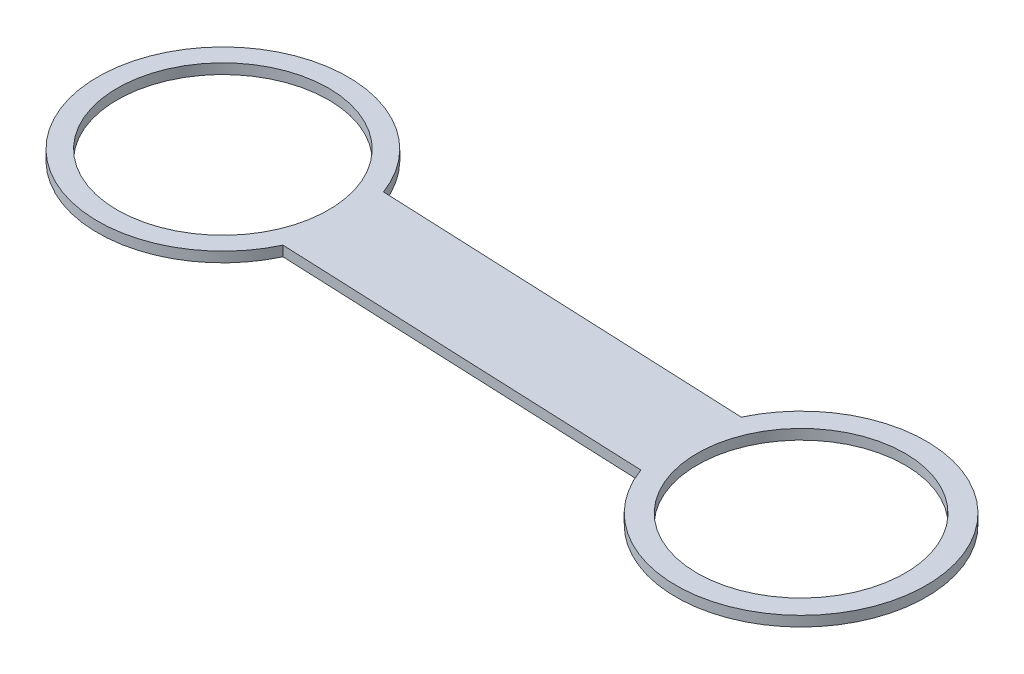
ISO-10303-21;
HEADER;
FILE_DESCRIPTION(('STEP AP214'),'2;1');
FILE_NAME('part.step','',(''),(''),'','','');
FILE_SCHEMA(('AUTOMOTIVE_DESIGN { 1 0 10303 214 1 1 1 1 }'));
ENDSEC;
DATA;
#1=APPLICATION_CONTEXT('core data for automotive mechanical design processes');
#2=APPLICATION_PROTOCOL_DEFINITION('international standard','automotive_design',2000,#1);
#3=PRODUCT_CONTEXT('',#1,'mechanical');
#4=PRODUCT('Part','Part','',(#3));
#5=PRODUCT_RELATED_PRODUCT_CATEGORY('part','',(#4));
#6=PRODUCT_DEFINITION_FORMATION('','',#4);
#7=PRODUCT_DEFINITION_CONTEXT('part definition',#1,'design');
#8=PRODUCT_DEFINITION('design','',#6,#7);
#9=PRODUCT_DEFINITION_SHAPE('','',#8);
#10=(LENGTH_UNIT() NAMED_UNIT(*) SI_UNIT(.MILLI.,.METRE.));
#11=(NAMED_UNIT(*) PLANE_ANGLE_UNIT() SI_UNIT($,.RADIAN.));
#12=(NAMED_UNIT(*) SI_UNIT($,.STERADIAN.) SOLID_ANGLE_UNIT());
#13=UNCERTAINTY_MEASURE_WITH_UNIT(LENGTH_MEASURE(1.E-05),#10,'distance_accuracy_value','');
#14=(GEOMETRIC_REPRESENTATION_CONTEXT(3) GLOBAL_UNCERTAINTY_ASSIGNED_CONTEXT((#13)) GLOBAL_UNIT_ASSIGNED_CONTEXT((#10,
#11,#12)) REPRESENTATION_CONTEXT('',''));
#15=CARTESIAN_POINT('',(0.,0.,0.));
#16=DIRECTION('',(0.,0.,1.));
#17=DIRECTION('',(1.,0.,0.));
#18=AXIS2_PLACEMENT_3D('',#15,#16,#17);
#19=CARTESIAN_POINT('',(178.811009985878,3.,7.77208167310776));
#20=DIRECTION('',(0.,1.,0.));
#21=DIRECTION('',(0.,0.,1.));
#22=AXIS2_PLACEMENT_3D('',#19,#20,#21);
#23=PLANE('',#22);
#24=CARTESIAN_POINT('',(0.,3.,0.));
#25=DIRECTION('',(0.,1.,0.));
#26=DIRECTION('',(0.,0.,1.));
#27=AXIS2_PLACEMENT_3D('',#24,#25,#26);
#28=CIRCLE('',#27,31.242);
#29=CARTESIAN_POINT('',(0.,3.,31.242));
#30=VERTEX_POINT('',#29);
#31=EDGE_CURVE('E100',#30,#30,#28,.T.);
#32=ORIENTED_EDGE('',*,*,#31,.F.);
#33=EDGE_LOOP('',(#32));
#34=FACE_BOUND('',#33,.T.);
#35=CARTESIAN_POINT('',(178.811009985878,3.,7.77208167310776));
#36=DIRECTION('',(0.,1.,0.));
#37=DIRECTION('',(0.,0.,1.));
#38=AXIS2_PLACEMENT_3D('',#35,#36,#37);
#39=CIRCLE('',#38,37.);
#40=CARTESIAN_POINT('',(144.033066177761,3.,20.4011997927322));
#41=VERTEX_POINT('',#40);
#42=CARTESIAN_POINT('',(145.341023246645,3.,-8.00004524990167));
#43=VERTEX_POINT('',#42);
#44=EDGE_CURVE('E85',#41,#43,#39,.T.);
#45=ORIENTED_EDGE('',*,*,#44,.T.);
#46=DIRECTION('',(-0.999069440720653,0.,-0.0431306459274788));
#47=VECTOR('',#46,1.);
#48=CARTESIAN_POINT('',(34.7244553413585,3.,-12.7754530740009));
#49=LINE('',#48,#47);
#50=CARTESIAN_POINT('',(34.7244553413585,3.,-12.7754530740009));
#51=VERTEX_POINT('',#50);
#52=EDGE_CURVE('E80',#43,#51,#49,.T.);
#53=ORIENTED_EDGE('',*,*,#52,.T.);
#54=CARTESIAN_POINT('',(0.,3.,0.));
#55=DIRECTION('',(0.,1.,0.));
#56=DIRECTION('',(0.,0.,1.));
#57=AXIS2_PLACEMENT_3D('',#54,#55,#56);
#58=CIRCLE('',#57,37.);
#59=CARTESIAN_POINT('',(33.4954140569429,3.,15.7180544964684));
#60=VERTEX_POINT('',#59);
#61=EDGE_CURVE('E83',#51,#60,#58,.T.);
#62=ORIENTED_EDGE('',*,*,#61,.T.);
#63=DIRECTION('',(0.99910372636415,0.,0.042328996743008));
#64=VECTOR('',#63,1.);
#65=CARTESIAN_POINT('',(33.4954140569429,3.,15.7180544964684));
#66=LINE('',#65,#64);
#67=EDGE_CURVE('E50',#60,#41,#66,.T.);
#68=ORIENTED_EDGE('',*,*,#67,.T.);
#69=EDGE_LOOP('',(#45,#53,#62,#68));
#70=FACE_BOUND('',#69,.T.);
#71=CARTESIAN_POINT('',(178.811009985878,3.,7.77208167310776));
#72=DIRECTION('',(0.,1.,0.));
#73=DIRECTION('',(0.,0.,1.));
#74=AXIS2_PLACEMENT_3D('',#71,#72,#73);
#75=CIRCLE('',#74,30.734);
#76=CARTESIAN_POINT('',(178.811009985878,3.,38.5060816731077));
#77=VERTEX_POINT('',#76);
#78=EDGE_CURVE('E115',#77,#77,#75,.T.);
#79=ORIENTED_EDGE('',*,*,#78,.F.);
#80=EDGE_LOOP('',(#79));
#81=FACE_BOUND('',#80,.T.);
#82=ADVANCED_FACE('F33',(#34,#70,#81),#23,.T.);
#83=CARTESIAN_POINT('',(178.811009985878,0.,7.77208167310776));
#84=DIRECTION('',(0.,1.,0.));
#85=DIRECTION('',(0.,0.,1.));
#86=AXIS2_PLACEMENT_3D('',#83,#84,#85);
#87=PLANE('',#86);
#88=CARTESIAN_POINT('',(178.811009985878,0.,7.77208167310776));
#89=DIRECTION('',(0.,1.,0.));
#90=DIRECTION('',(0.,0.,1.));
#91=AXIS2_PLACEMENT_3D('',#88,#89,#90);
#92=CIRCLE('',#91,37.);
#93=CARTESIAN_POINT('',(144.033066177761,0.,20.4011997927322));
#94=VERTEX_POINT('',#93);
#95=CARTESIAN_POINT('',(145.341023246645,0.,-8.00004524990167));
#96=VERTEX_POINT('',#95);
#97=EDGE_CURVE('E97',#94,#96,#92,.T.);
#98=ORIENTED_EDGE('',*,*,#97,.F.);
#99=DIRECTION('',(0.99910372636415,0.,0.042328996743008));
#100=VECTOR('',#99,1.);
#101=CARTESIAN_POINT('',(33.4954140569429,0.,15.7180544964684));
#102=LINE('',#101,#100);
#103=CARTESIAN_POINT('',(33.4954140569429,0.,15.7180544964684));
#104=VERTEX_POINT('',#103);
#105=EDGE_CURVE('E73',#104,#94,#102,.T.);
#106=ORIENTED_EDGE('',*,*,#105,.F.);
#107=CARTESIAN_POINT('',(0.,0.,0.));
#108=DIRECTION('',(0.,1.,0.));
#109=DIRECTION('',(0.,0.,1.));
#110=AXIS2_PLACEMENT_3D('',#107,#108,#109);
#111=CIRCLE('',#110,37.);
#112=CARTESIAN_POINT('',(34.7244553413585,0.,-12.7754530740009));
#113=VERTEX_POINT('',#112);
#114=EDGE_CURVE('E67',#113,#104,#111,.T.);
#115=ORIENTED_EDGE('',*,*,#114,.F.);
#116=DIRECTION('',(-0.999069440720653,0.,-0.0431306459274788));
#117=VECTOR('',#116,1.);
#118=CARTESIAN_POINT('',(34.7244553413585,0.,-12.7754530740009));
#119=LINE('',#118,#117);
#120=EDGE_CURVE('E89',#96,#113,#119,.T.);
#121=ORIENTED_EDGE('',*,*,#120,.F.);
#122=EDGE_LOOP('',(#98,#106,#115,#121));
#123=FACE_BOUND('',#122,.T.);
#124=CARTESIAN_POINT('',(0.,0.,0.));
#125=DIRECTION('',(0.,1.,0.));
#126=DIRECTION('',(0.,0.,1.));
#127=AXIS2_PLACEMENT_3D('',#124,#125,#126);
#128=CIRCLE('',#127,31.242);
#129=CARTESIAN_POINT('',(0.,0.,31.242));
#130=VERTEX_POINT('',#129);
#131=EDGE_CURVE('E112',#130,#130,#128,.T.);
#132=ORIENTED_EDGE('',*,*,#131,.T.);
#133=EDGE_LOOP('',(#132));
#134=FACE_BOUND('',#133,.T.);
#135=CARTESIAN_POINT('',(178.811009985878,0.,7.77208167310776));
#136=DIRECTION('',(0.,1.,0.));
#137=DIRECTION('',(0.,0.,1.));
#138=AXIS2_PLACEMENT_3D('',#135,#136,#137);
#139=CIRCLE('',#138,30.734);
#140=CARTESIAN_POINT('',(178.811009985878,0.,38.5060816731077));
#141=VERTEX_POINT('',#140);
#142=EDGE_CURVE('E118',#141,#141,#139,.T.);
#143=ORIENTED_EDGE('',*,*,#142,.T.);
#144=EDGE_LOOP('',(#143));
#145=FACE_BOUND('',#144,.T.);
#146=ADVANCED_FACE('F108',(#123,#134,#145),#87,.F.);
#147=CARTESIAN_POINT('',(178.811009985878,3.,7.77208167310776));
#148=DIRECTION('',(0.,-1.,0.));
#149=DIRECTION('',(0.,0.,-1.));
#150=AXIS2_PLACEMENT_3D('',#147,#148,#149);
#151=CYLINDRICAL_SURFACE('',#150,37.);
#152=ORIENTED_EDGE('',*,*,#97,.T.);
#153=DIRECTION('',(0.,-1.,0.));
#154=VECTOR('',#153,1.);
#155=CARTESIAN_POINT('',(145.341023246645,3.,-8.00004524990167));
#156=LINE('',#155,#154);
#157=EDGE_CURVE('E11',#43,#96,#156,.T.);
#158=ORIENTED_EDGE('',*,*,#157,.F.);
#159=ORIENTED_EDGE('',*,*,#44,.F.);
#160=DIRECTION('',(0.,-1.,0.));
#161=VECTOR('',#160,1.);
#162=CARTESIAN_POINT('',(144.033066177761,3.,20.4011997927322));
#163=LINE('',#162,#161);
#164=EDGE_CURVE('E93',#41,#94,#163,.T.);
#165=ORIENTED_EDGE('',*,*,#164,.T.);
#166=EDGE_LOOP('',(#152,#158,#159,#165));
#167=FACE_BOUND('',#166,.T.);
#168=ADVANCED_FACE('F35',(#167),#151,.T.);
#169=CARTESIAN_POINT('',(34.7244553413585,3.,-12.7754530740009));
#170=DIRECTION('',(-0.0431306459274788,0.,0.999069440720653));
#171=DIRECTION('',(0.999069440720653,0.,0.0431306459274788));
#172=AXIS2_PLACEMENT_3D('',#169,#170,#171);
#173=PLANE('',#172);
#174=ORIENTED_EDGE('',*,*,#120,.T.);
#175=DIRECTION('',(0.,-1.,0.));
#176=VECTOR('',#175,1.);
#177=CARTESIAN_POINT('',(34.7244553413585,3.,-12.7754530740009));
#178=LINE('',#177,#176);
#179=EDGE_CURVE('E42',#51,#113,#178,.T.);
#180=ORIENTED_EDGE('',*,*,#179,.F.);
#181=ORIENTED_EDGE('',*,*,#52,.F.);
#182=ORIENTED_EDGE('',*,*,#157,.T.);
#183=EDGE_LOOP('',(#174,#180,#181,#182));
#184=FACE_BOUND('',#183,.T.);
#185=ADVANCED_FACE('F88',(#184),#173,.F.);
#186=CARTESIAN_POINT('',(0.,3.,0.));
#187=DIRECTION('',(0.,-1.,0.));
#188=DIRECTION('',(0.,0.,-1.));
#189=AXIS2_PLACEMENT_3D('',#186,#187,#188);
#190=CYLINDRICAL_SURFACE('',#189,37.);
#191=ORIENTED_EDGE('',*,*,#114,.T.);
#192=DIRECTION('',(0.,-1.,0.));
#193=VECTOR('',#192,1.);
#194=CARTESIAN_POINT('',(33.4954140569429,3.,15.7180544964684));
#195=LINE('',#194,#193);
#196=EDGE_CURVE('E90',#60,#104,#195,.T.);
#197=ORIENTED_EDGE('',*,*,#196,.F.);
#198=ORIENTED_EDGE('',*,*,#61,.F.);
#199=ORIENTED_EDGE('',*,*,#179,.T.);
#200=EDGE_LOOP('',(#191,#197,#198,#199));
#201=FACE_BOUND('',#200,.T.);
#202=ADVANCED_FACE('F91',(#201),#190,.T.);
#203=CARTESIAN_POINT('',(33.4954140569429,3.,15.7180544964684));
#204=DIRECTION('',(0.042328996743008,0.,-0.99910372636415));
#205=DIRECTION('',(-0.99910372636415,0.,-0.042328996743008));
#206=AXIS2_PLACEMENT_3D('',#203,#204,#205);
#207=PLANE('',#206);
#208=ORIENTED_EDGE('',*,*,#105,.T.);
#209=ORIENTED_EDGE('',*,*,#164,.F.);
#210=ORIENTED_EDGE('',*,*,#67,.F.);
#211=ORIENTED_EDGE('',*,*,#196,.T.);
#212=EDGE_LOOP('',(#208,#209,#210,#211));
#213=FACE_BOUND('',#212,.T.);
#214=ADVANCED_FACE('F105',(#213),#207,.F.);
#215=CARTESIAN_POINT('',(0.,3.,0.));
#216=DIRECTION('',(0.,-1.,0.));
#217=DIRECTION('',(0.,0.,-1.));
#218=AXIS2_PLACEMENT_3D('',#215,#216,#217);
#219=CYLINDRICAL_SURFACE('',#218,31.242);
#220=ORIENTED_EDGE('',*,*,#31,.T.);
#221=EDGE_LOOP('',(#220));
#222=FACE_BOUND('',#221,.T.);
#223=ORIENTED_EDGE('',*,*,#131,.F.);
#224=EDGE_LOOP('',(#223));
#225=FACE_BOUND('',#224,.T.);
#226=ADVANCED_FACE('F135',(#222,#225),#219,.F.);
#227=CARTESIAN_POINT('',(178.811009985878,3.,7.77208167310776));
#228=DIRECTION('',(0.,-1.,0.));
#229=DIRECTION('',(0.,0.,-1.));
#230=AXIS2_PLACEMENT_3D('',#227,#228,#229);
#231=CYLINDRICAL_SURFACE('',#230,30.734);
#232=ORIENTED_EDGE('',*,*,#78,.T.);
#233=EDGE_LOOP('',(#232));
#234=FACE_BOUND('',#233,.T.);
#235=ORIENTED_EDGE('',*,*,#142,.F.);
#236=EDGE_LOOP('',(#235));
#237=FACE_BOUND('',#236,.T.);
#238=ADVANCED_FACE('F124',(#234,#237),#231,.F.);
#239=CLOSED_SHELL('',(#82,#146,#168,#185,#202,#214,#226,#238));
#240=MANIFOLD_SOLID_BREP('B2',#239);
#241=ADVANCED_BREP_SHAPE_REPRESENTATION('',(#18,#240),#14);
#242=SHAPE_DEFINITION_REPRESENTATION(#9,#241);
ENDSEC;
END-ISO-10303-21;
